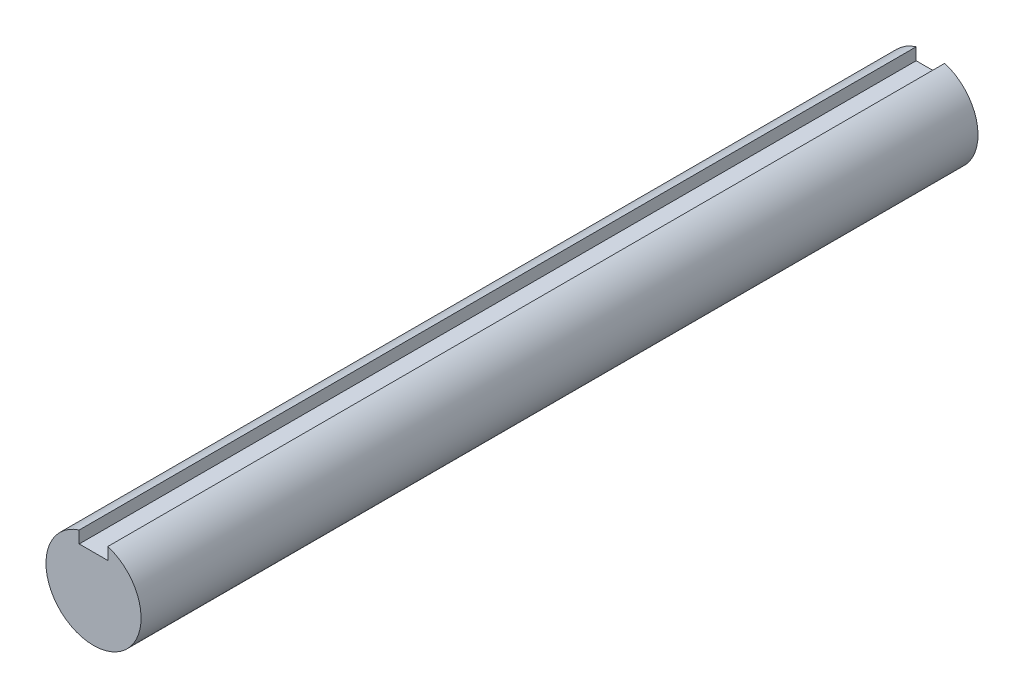
ISO-10303-21;
HEADER;
FILE_DESCRIPTION(('STEP AP214'),'2;1');
FILE_NAME('part.step','',(''),(''),'','','');
FILE_SCHEMA(('AUTOMOTIVE_DESIGN { 1 0 10303 214 1 1 1 1 }'));
ENDSEC;
DATA;
#1=APPLICATION_CONTEXT('core data for automotive mechanical design processes');
#2=APPLICATION_PROTOCOL_DEFINITION('international standard','automotive_design',2000,#1);
#3=PRODUCT_CONTEXT('',#1,'mechanical');
#4=PRODUCT('Part','Part','',(#3));
#5=PRODUCT_RELATED_PRODUCT_CATEGORY('part','',(#4));
#6=PRODUCT_DEFINITION_FORMATION('','',#4);
#7=PRODUCT_DEFINITION_CONTEXT('part definition',#1,'design');
#8=PRODUCT_DEFINITION('design','',#6,#7);
#9=PRODUCT_DEFINITION_SHAPE('','',#8);
#10=(LENGTH_UNIT() NAMED_UNIT(*) SI_UNIT(.MILLI.,.METRE.));
#11=(NAMED_UNIT(*) PLANE_ANGLE_UNIT() SI_UNIT($,.RADIAN.));
#12=(NAMED_UNIT(*) SI_UNIT($,.STERADIAN.) SOLID_ANGLE_UNIT());
#13=UNCERTAINTY_MEASURE_WITH_UNIT(LENGTH_MEASURE(1.E-05),#10,'distance_accuracy_value','');
#14=(GEOMETRIC_REPRESENTATION_CONTEXT(3) GLOBAL_UNCERTAINTY_ASSIGNED_CONTEXT((#13)) GLOBAL_UNIT_ASSIGNED_CONTEXT((#10,
#11,#12)) REPRESENTATION_CONTEXT('',''));
#15=CARTESIAN_POINT('',(0.,0.,0.));
#16=DIRECTION('',(0.,0.,1.));
#17=DIRECTION('',(1.,0.,0.));
#18=AXIS2_PLACEMENT_3D('',#15,#16,#17);
#19=CARTESIAN_POINT('',(0.,0.,34.925));
#20=DIRECTION('',(0.,0.,-1.));
#21=DIRECTION('',(-1.,0.,0.));
#22=AXIS2_PLACEMENT_3D('',#19,#20,#21);
#23=CYLINDRICAL_SURFACE('',#22,3.96874999999999);
#24=DIRECTION('',(0.,0.,-1.));
#25=VECTOR('',#24,1.);
#26=CARTESIAN_POINT('',(-1.1938,3.78494625093936,34.925));
#27=LINE('',#26,#25);
#28=CARTESIAN_POINT('',(-1.1938,3.78494625093936,34.925));
#29=VERTEX_POINT('',#28);
#30=CARTESIAN_POINT('',(-1.1938,3.78494625093936,-34.925));
#31=VERTEX_POINT('',#30);
#32=EDGE_CURVE('E102',#29,#31,#27,.T.);
#33=ORIENTED_EDGE('',*,*,#32,.T.);
#34=CARTESIAN_POINT('',(0.,0.,-34.925));
#35=DIRECTION('',(0.,0.,1.));
#36=DIRECTION('',(1.,0.,0.));
#37=AXIS2_PLACEMENT_3D('',#34,#35,#36);
#38=CIRCLE('',#37,3.96874999999999);
#39=CARTESIAN_POINT('',(1.1938,3.78494625093936,-34.925));
#40=VERTEX_POINT('',#39);
#41=EDGE_CURVE('E96',#31,#40,#38,.T.);
#42=ORIENTED_EDGE('',*,*,#41,.T.);
#43=DIRECTION('',(0.,0.,-1.));
#44=VECTOR('',#43,1.);
#45=CARTESIAN_POINT('',(1.1938,3.78494625093936,34.925));
#46=LINE('',#45,#44);
#47=CARTESIAN_POINT('',(1.1938,3.78494625093936,34.925));
#48=VERTEX_POINT('',#47);
#49=EDGE_CURVE('E11',#48,#40,#46,.T.);
#50=ORIENTED_EDGE('',*,*,#49,.F.);
#51=CARTESIAN_POINT('',(0.,0.,34.925));
#52=DIRECTION('',(0.,0.,1.));
#53=DIRECTION('',(1.,0.,0.));
#54=AXIS2_PLACEMENT_3D('',#51,#52,#53);
#55=CIRCLE('',#54,3.96874999999999);
#56=EDGE_CURVE('E111',#29,#48,#55,.T.);
#57=ORIENTED_EDGE('',*,*,#56,.F.);
#58=EDGE_LOOP('',(#33,#42,#50,#57));
#59=FACE_BOUND('',#58,.T.);
#60=ADVANCED_FACE('F43',(#59),#23,.T.);
#61=CARTESIAN_POINT('',(1.1938,2.77494999999999,34.925));
#62=DIRECTION('',(1.,0.,0.));
#63=DIRECTION('',(0.,0.,-1.));
#64=AXIS2_PLACEMENT_3D('',#61,#62,#63);
#65=PLANE('',#64);
#66=ORIENTED_EDGE('',*,*,#49,.T.);
#67=DIRECTION('',(0.,-1.,0.));
#68=VECTOR('',#67,1.);
#69=CARTESIAN_POINT('',(1.1938,2.77494999999999,-34.925));
#70=LINE('',#69,#68);
#71=CARTESIAN_POINT('',(1.1938,2.77494999999999,-34.925));
#72=VERTEX_POINT('',#71);
#73=EDGE_CURVE('E86',#40,#72,#70,.T.);
#74=ORIENTED_EDGE('',*,*,#73,.T.);
#75=DIRECTION('',(0.,0.,-1.));
#76=VECTOR('',#75,1.);
#77=CARTESIAN_POINT('',(1.1938,2.77494999999999,34.925));
#78=LINE('',#77,#76);
#79=CARTESIAN_POINT('',(1.1938,2.77494999999999,34.925));
#80=VERTEX_POINT('',#79);
#81=EDGE_CURVE('E51',#80,#72,#78,.T.);
#82=ORIENTED_EDGE('',*,*,#81,.F.);
#83=DIRECTION('',(0.,-1.,0.));
#84=VECTOR('',#83,1.);
#85=CARTESIAN_POINT('',(1.1938,2.77494999999999,34.925));
#86=LINE('',#85,#84);
#87=EDGE_CURVE('E87',#48,#80,#86,.T.);
#88=ORIENTED_EDGE('',*,*,#87,.F.);
#89=EDGE_LOOP('',(#66,#74,#82,#88));
#90=FACE_BOUND('',#89,.T.);
#91=ADVANCED_FACE('F84',(#90),#65,.F.);
#92=CARTESIAN_POINT('',(1.1938,2.77494999999999,34.925));
#93=DIRECTION('',(0.,-1.,0.));
#94=DIRECTION('',(0.,0.,-1.));
#95=AXIS2_PLACEMENT_3D('',#92,#93,#94);
#96=PLANE('',#95);
#97=ORIENTED_EDGE('',*,*,#81,.T.);
#98=DIRECTION('',(-1.,0.,0.));
#99=VECTOR('',#98,1.);
#100=CARTESIAN_POINT('',(1.1938,2.77494999999999,-34.925));
#101=LINE('',#100,#99);
#102=CARTESIAN_POINT('',(-1.1938,2.77494999999999,-34.925));
#103=VERTEX_POINT('',#102);
#104=EDGE_CURVE('E99',#72,#103,#101,.T.);
#105=ORIENTED_EDGE('',*,*,#104,.T.);
#106=DIRECTION('',(0.,0.,-1.));
#107=VECTOR('',#106,1.);
#108=CARTESIAN_POINT('',(-1.1938,2.77494999999999,34.925));
#109=LINE('',#108,#107);
#110=CARTESIAN_POINT('',(-1.1938,2.77494999999999,34.925));
#111=VERTEX_POINT('',#110);
#112=EDGE_CURVE('E122',#111,#103,#109,.T.);
#113=ORIENTED_EDGE('',*,*,#112,.F.);
#114=DIRECTION('',(-1.,0.,0.));
#115=VECTOR('',#114,1.);
#116=CARTESIAN_POINT('',(1.1938,2.77494999999999,34.925));
#117=LINE('',#116,#115);
#118=EDGE_CURVE('E63',#80,#111,#117,.T.);
#119=ORIENTED_EDGE('',*,*,#118,.F.);
#120=EDGE_LOOP('',(#97,#105,#113,#119));
#121=FACE_BOUND('',#120,.T.);
#122=ADVANCED_FACE('F126',(#121),#96,.F.);
#123=CARTESIAN_POINT('',(-1.1938,2.77494999999999,34.925));
#124=DIRECTION('',(-1.,0.,0.));
#125=DIRECTION('',(0.,0.,1.));
#126=AXIS2_PLACEMENT_3D('',#123,#124,#125);
#127=PLANE('',#126);
#128=ORIENTED_EDGE('',*,*,#112,.T.);
#129=DIRECTION('',(0.,1.,0.));
#130=VECTOR('',#129,1.);
#131=CARTESIAN_POINT('',(-1.1938,2.77494999999999,-34.925));
#132=LINE('',#131,#130);
#133=EDGE_CURVE('E108',#103,#31,#132,.T.);
#134=ORIENTED_EDGE('',*,*,#133,.T.);
#135=ORIENTED_EDGE('',*,*,#32,.F.);
#136=DIRECTION('',(0.,1.,0.));
#137=VECTOR('',#136,1.);
#138=CARTESIAN_POINT('',(-1.1938,2.77494999999999,34.925));
#139=LINE('',#138,#137);
#140=EDGE_CURVE('E58',#111,#29,#139,.T.);
#141=ORIENTED_EDGE('',*,*,#140,.F.);
#142=EDGE_LOOP('',(#128,#134,#135,#141));
#143=FACE_BOUND('',#142,.T.);
#144=ADVANCED_FACE('F128',(#143),#127,.F.);
#145=CARTESIAN_POINT('',(0.,0.,34.925));
#146=DIRECTION('',(0.,0.,1.));
#147=DIRECTION('',(1.,0.,0.));
#148=AXIS2_PLACEMENT_3D('',#145,#146,#147);
#149=PLANE('',#148);
#150=ORIENTED_EDGE('',*,*,#56,.T.);
#151=ORIENTED_EDGE('',*,*,#87,.T.);
#152=ORIENTED_EDGE('',*,*,#118,.T.);
#153=ORIENTED_EDGE('',*,*,#140,.T.);
#154=EDGE_LOOP('',(#150,#151,#152,#153));
#155=FACE_BOUND('',#154,.T.);
#156=ADVANCED_FACE('F129',(#155),#149,.T.);
#157=CARTESIAN_POINT('',(0.,0.,-34.925));
#158=DIRECTION('',(0.,0.,1.));
#159=DIRECTION('',(1.,0.,0.));
#160=AXIS2_PLACEMENT_3D('',#157,#158,#159);
#161=PLANE('',#160);
#162=ORIENTED_EDGE('',*,*,#41,.F.);
#163=ORIENTED_EDGE('',*,*,#133,.F.);
#164=ORIENTED_EDGE('',*,*,#104,.F.);
#165=ORIENTED_EDGE('',*,*,#73,.F.);
#166=EDGE_LOOP('',(#162,#163,#164,#165));
#167=FACE_BOUND('',#166,.T.);
#168=ADVANCED_FACE('F94',(#167),#161,.F.);
#169=CLOSED_SHELL('',(#60,#91,#122,#144,#156,#168));
#170=MANIFOLD_SOLID_BREP('B2',#169);
#171=ADVANCED_BREP_SHAPE_REPRESENTATION('',(#18,#170),#14);
#172=SHAPE_DEFINITION_REPRESENTATION(#9,#171);
ENDSEC;
END-ISO-10303-21;
